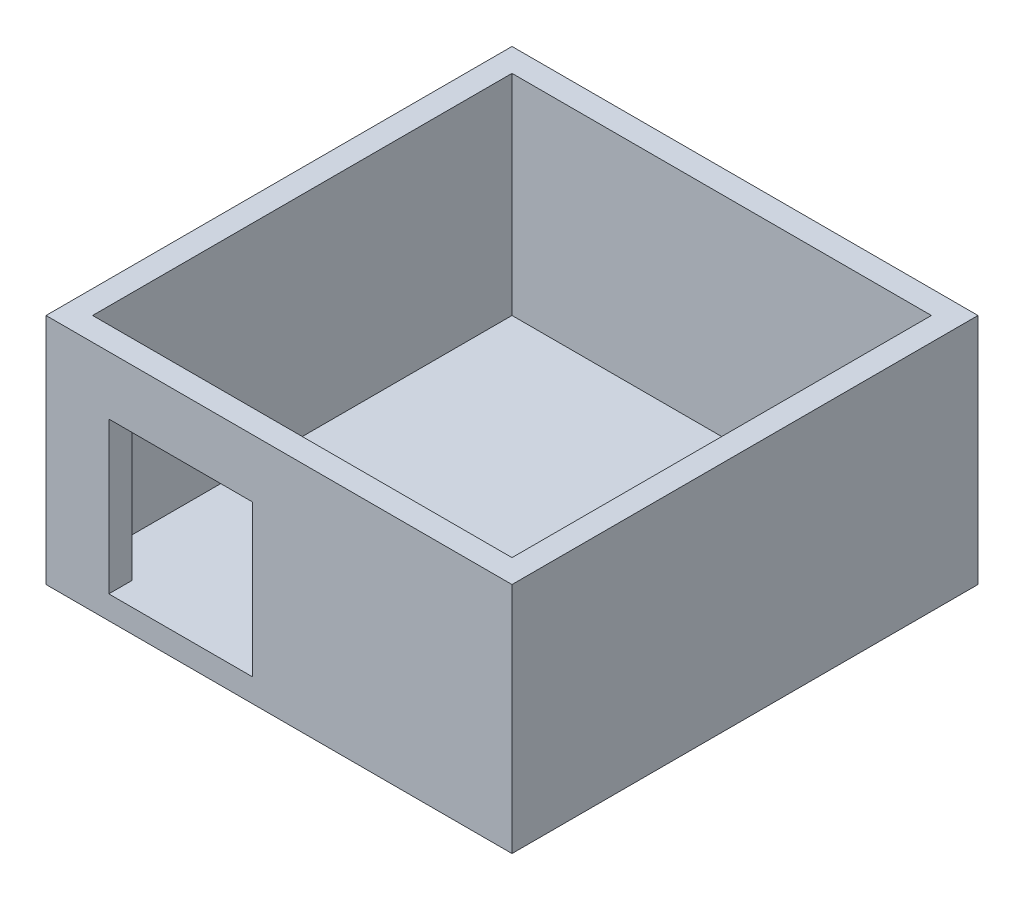
ISO-10303-21;
HEADER;
FILE_DESCRIPTION(('STEP AP214'),'2;1');
FILE_NAME('part.step','',(''),(''),'','','');
FILE_SCHEMA(('AUTOMOTIVE_DESIGN { 1 0 10303 214 1 1 1 1 }'));
ENDSEC;
DATA;
#1=APPLICATION_CONTEXT('core data for automotive mechanical design processes');
#2=APPLICATION_PROTOCOL_DEFINITION('international standard','automotive_design',2000,#1);
#3=PRODUCT_CONTEXT('',#1,'mechanical');
#4=PRODUCT('Part','Part','',(#3));
#5=PRODUCT_RELATED_PRODUCT_CATEGORY('part','',(#4));
#6=PRODUCT_DEFINITION_FORMATION('','',#4);
#7=PRODUCT_DEFINITION_CONTEXT('part definition',#1,'design');
#8=PRODUCT_DEFINITION('design','',#6,#7);
#9=PRODUCT_DEFINITION_SHAPE('','',#8);
#10=(LENGTH_UNIT() NAMED_UNIT(*) SI_UNIT(.MILLI.,.METRE.));
#11=(NAMED_UNIT(*) PLANE_ANGLE_UNIT() SI_UNIT($,.RADIAN.));
#12=(NAMED_UNIT(*) SI_UNIT($,.STERADIAN.) SOLID_ANGLE_UNIT());
#13=UNCERTAINTY_MEASURE_WITH_UNIT(LENGTH_MEASURE(1.E-05),#10,'distance_accuracy_value','');
#14=(GEOMETRIC_REPRESENTATION_CONTEXT(3) GLOBAL_UNCERTAINTY_ASSIGNED_CONTEXT((#13)) GLOBAL_UNIT_ASSIGNED_CONTEXT((#10,
#11,#12)) REPRESENTATION_CONTEXT('',''));
#15=CARTESIAN_POINT('',(0.,0.,0.));
#16=DIRECTION('',(0.,0.,1.));
#17=DIRECTION('',(1.,0.,0.));
#18=AXIS2_PLACEMENT_3D('',#15,#16,#17);
#19=CARTESIAN_POINT('',(20.,20.,-20.));
#20=DIRECTION('',(-1.,0.,0.));
#21=DIRECTION('',(0.,0.,1.));
#22=AXIS2_PLACEMENT_3D('',#19,#20,#21);
#23=PLANE('',#22);
#24=DIRECTION('',(0.,0.,-1.));
#25=VECTOR('',#24,1.);
#26=CARTESIAN_POINT('',(20.,0.,-20.));
#27=LINE('',#26,#25);
#28=CARTESIAN_POINT('',(20.,0.,20.));
#29=VERTEX_POINT('',#28);
#30=CARTESIAN_POINT('',(20.,0.,-20.));
#31=VERTEX_POINT('',#30);
#32=EDGE_CURVE('E195',#29,#31,#27,.T.);
#33=ORIENTED_EDGE('',*,*,#32,.T.);
#34=DIRECTION('',(0.,-1.,0.));
#35=VECTOR('',#34,1.);
#36=CARTESIAN_POINT('',(20.,20.,-20.));
#37=LINE('',#36,#35);
#38=CARTESIAN_POINT('',(20.,20.,-20.));
#39=VERTEX_POINT('',#38);
#40=EDGE_CURVE('E11',#39,#31,#37,.T.);
#41=ORIENTED_EDGE('',*,*,#40,.F.);
#42=DIRECTION('',(0.,0.,-1.));
#43=VECTOR('',#42,1.);
#44=CARTESIAN_POINT('',(20.,20.,-20.));
#45=LINE('',#44,#43);
#46=CARTESIAN_POINT('',(20.,20.,20.));
#47=VERTEX_POINT('',#46);
#48=EDGE_CURVE('E180',#47,#39,#45,.T.);
#49=ORIENTED_EDGE('',*,*,#48,.F.);
#50=DIRECTION('',(0.,-1.,0.));
#51=VECTOR('',#50,1.);
#52=CARTESIAN_POINT('',(20.,20.,20.));
#53=LINE('',#52,#51);
#54=EDGE_CURVE('E194',#47,#29,#53,.T.);
#55=ORIENTED_EDGE('',*,*,#54,.T.);
#56=EDGE_LOOP('',(#33,#41,#49,#55));
#57=FACE_BOUND('',#56,.T.);
#58=ADVANCED_FACE('F45',(#57),#23,.F.);
#59=CARTESIAN_POINT('',(-20.,20.,-20.));
#60=DIRECTION('',(0.,0.,1.));
#61=DIRECTION('',(1.,0.,0.));
#62=AXIS2_PLACEMENT_3D('',#59,#60,#61);
#63=PLANE('',#62);
#64=DIRECTION('',(-1.,0.,0.));
#65=VECTOR('',#64,1.);
#66=CARTESIAN_POINT('',(-20.,0.,-20.));
#67=LINE('',#66,#65);
#68=CARTESIAN_POINT('',(-20.,0.,-20.));
#69=VERTEX_POINT('',#68);
#70=EDGE_CURVE('E199',#31,#69,#67,.T.);
#71=ORIENTED_EDGE('',*,*,#70,.T.);
#72=DIRECTION('',(0.,-1.,0.));
#73=VECTOR('',#72,1.);
#74=CARTESIAN_POINT('',(-20.,20.,-20.));
#75=LINE('',#74,#73);
#76=CARTESIAN_POINT('',(-20.,20.,-20.));
#77=VERTEX_POINT('',#76);
#78=EDGE_CURVE('E53',#77,#69,#75,.T.);
#79=ORIENTED_EDGE('',*,*,#78,.F.);
#80=DIRECTION('',(-1.,0.,0.));
#81=VECTOR('',#80,1.);
#82=CARTESIAN_POINT('',(-20.,20.,-20.));
#83=LINE('',#82,#81);
#84=EDGE_CURVE('E184',#39,#77,#83,.T.);
#85=ORIENTED_EDGE('',*,*,#84,.F.);
#86=ORIENTED_EDGE('',*,*,#40,.T.);
#87=EDGE_LOOP('',(#71,#79,#85,#86));
#88=FACE_BOUND('',#87,.T.);
#89=ADVANCED_FACE('F236',(#88),#63,.F.);
#90=CARTESIAN_POINT('',(-20.,20.,-20.));
#91=DIRECTION('',(1.,0.,0.));
#92=DIRECTION('',(0.,0.,-1.));
#93=AXIS2_PLACEMENT_3D('',#90,#91,#92);
#94=PLANE('',#93);
#95=DIRECTION('',(0.,0.,1.));
#96=VECTOR('',#95,1.);
#97=CARTESIAN_POINT('',(-20.,0.,-20.));
#98=LINE('',#97,#96);
#99=CARTESIAN_POINT('',(-20.,0.,20.));
#100=VERTEX_POINT('',#99);
#101=EDGE_CURVE('E203',#69,#100,#98,.T.);
#102=ORIENTED_EDGE('',*,*,#101,.T.);
#103=DIRECTION('',(0.,-1.,0.));
#104=VECTOR('',#103,1.);
#105=CARTESIAN_POINT('',(-20.,20.,20.));
#106=LINE('',#105,#104);
#107=CARTESIAN_POINT('',(-20.,20.,20.));
#108=VERTEX_POINT('',#107);
#109=EDGE_CURVE('E211',#108,#100,#106,.T.);
#110=ORIENTED_EDGE('',*,*,#109,.F.);
#111=DIRECTION('',(0.,0.,1.));
#112=VECTOR('',#111,1.);
#113=CARTESIAN_POINT('',(-20.,20.,-20.));
#114=LINE('',#113,#112);
#115=EDGE_CURVE('E188',#77,#108,#114,.T.);
#116=ORIENTED_EDGE('',*,*,#115,.F.);
#117=ORIENTED_EDGE('',*,*,#78,.T.);
#118=EDGE_LOOP('',(#102,#110,#116,#117));
#119=FACE_BOUND('',#118,.T.);
#120=ADVANCED_FACE('F220',(#119),#94,.F.);
#121=CARTESIAN_POINT('',(-20.,20.,20.));
#122=DIRECTION('',(0.,0.,-1.));
#123=DIRECTION('',(-1.,0.,0.));
#124=AXIS2_PLACEMENT_3D('',#121,#122,#123);
#125=PLANE('',#124);
#126=DIRECTION('',(1.,0.,0.));
#127=VECTOR('',#126,1.);
#128=CARTESIAN_POINT('',(-14.6096875562385,2.,20.));
#129=LINE('',#128,#127);
#130=CARTESIAN_POINT('',(-14.6096875562385,2.,20.));
#131=VERTEX_POINT('',#130);
#132=CARTESIAN_POINT('',(-2.28968755623849,2.,20.));
#133=VERTEX_POINT('',#132);
#134=EDGE_CURVE('E287',#131,#133,#129,.T.);
#135=ORIENTED_EDGE('',*,*,#134,.F.);
#136=DIRECTION('',(0.,-1.,0.));
#137=VECTOR('',#136,1.);
#138=CARTESIAN_POINT('',(-14.6096875562385,15.,20.));
#139=LINE('',#138,#137);
#140=CARTESIAN_POINT('',(-14.6096875562385,15.,20.));
#141=VERTEX_POINT('',#140);
#142=EDGE_CURVE('E60',#141,#131,#139,.T.);
#143=ORIENTED_EDGE('',*,*,#142,.F.);
#144=DIRECTION('',(-1.,0.,0.));
#145=VECTOR('',#144,1.);
#146=CARTESIAN_POINT('',(-14.6096875562385,15.,20.));
#147=LINE('',#146,#145);
#148=CARTESIAN_POINT('',(-2.28968755623849,15.,20.));
#149=VERTEX_POINT('',#148);
#150=EDGE_CURVE('E151',#149,#141,#147,.T.);
#151=ORIENTED_EDGE('',*,*,#150,.F.);
#152=DIRECTION('',(0.,1.,0.));
#153=VECTOR('',#152,1.);
#154=CARTESIAN_POINT('',(-2.28968755623849,15.,20.));
#155=LINE('',#154,#153);
#156=EDGE_CURVE('E285',#133,#149,#155,.T.);
#157=ORIENTED_EDGE('',*,*,#156,.F.);
#158=EDGE_LOOP('',(#135,#143,#151,#157));
#159=FACE_BOUND('',#158,.T.);
#160=DIRECTION('',(1.,0.,0.));
#161=VECTOR('',#160,1.);
#162=CARTESIAN_POINT('',(-20.,0.,20.));
#163=LINE('',#162,#161);
#164=EDGE_CURVE('E185',#100,#29,#163,.T.);
#165=ORIENTED_EDGE('',*,*,#164,.T.);
#166=ORIENTED_EDGE('',*,*,#54,.F.);
#167=DIRECTION('',(1.,0.,0.));
#168=VECTOR('',#167,1.);
#169=CARTESIAN_POINT('',(-20.,20.,20.));
#170=LINE('',#169,#168);
#171=EDGE_CURVE('E191',#108,#47,#170,.T.);
#172=ORIENTED_EDGE('',*,*,#171,.F.);
#173=ORIENTED_EDGE('',*,*,#109,.T.);
#174=EDGE_LOOP('',(#165,#166,#172,#173));
#175=FACE_BOUND('',#174,.T.);
#176=ADVANCED_FACE('F229',(#159,#175),#125,.F.);
#177=CARTESIAN_POINT('',(0.,20.,0.));
#178=DIRECTION('',(0.,1.,0.));
#179=DIRECTION('',(0.,0.,1.));
#180=AXIS2_PLACEMENT_3D('',#177,#178,#179);
#181=PLANE('',#180);
#182=DIRECTION('',(0.,0.,-1.));
#183=VECTOR('',#182,1.);
#184=CARTESIAN_POINT('',(18.,20.,-20.));
#185=LINE('',#184,#183);
#186=CARTESIAN_POINT('',(18.,20.,18.));
#187=VERTEX_POINT('',#186);
#188=CARTESIAN_POINT('',(18.,20.,-18.));
#189=VERTEX_POINT('',#188);
#190=EDGE_CURVE('E159',#187,#189,#185,.T.);
#191=ORIENTED_EDGE('',*,*,#190,.F.);
#192=DIRECTION('',(1.,0.,0.));
#193=VECTOR('',#192,1.);
#194=CARTESIAN_POINT('',(-20.,20.,18.));
#195=LINE('',#194,#193);
#196=CARTESIAN_POINT('',(-18.,20.,18.));
#197=VERTEX_POINT('',#196);
#198=EDGE_CURVE('E176',#197,#187,#195,.T.);
#199=ORIENTED_EDGE('',*,*,#198,.F.);
#200=DIRECTION('',(0.,0.,1.));
#201=VECTOR('',#200,1.);
#202=CARTESIAN_POINT('',(-18.,20.,-20.));
#203=LINE('',#202,#201);
#204=CARTESIAN_POINT('',(-18.,20.,-18.));
#205=VERTEX_POINT('',#204);
#206=EDGE_CURVE('E172',#205,#197,#203,.T.);
#207=ORIENTED_EDGE('',*,*,#206,.F.);
#208=DIRECTION('',(-1.,0.,0.));
#209=VECTOR('',#208,1.);
#210=CARTESIAN_POINT('',(-20.,20.,-18.));
#211=LINE('',#210,#209);
#212=EDGE_CURVE('E164',#189,#205,#211,.T.);
#213=ORIENTED_EDGE('',*,*,#212,.F.);
#214=EDGE_LOOP('',(#191,#199,#207,#213));
#215=FACE_BOUND('',#214,.T.);
#216=ORIENTED_EDGE('',*,*,#48,.T.);
#217=ORIENTED_EDGE('',*,*,#84,.T.);
#218=ORIENTED_EDGE('',*,*,#115,.T.);
#219=ORIENTED_EDGE('',*,*,#171,.T.);
#220=EDGE_LOOP('',(#216,#217,#218,#219));
#221=FACE_BOUND('',#220,.T.);
#222=ADVANCED_FACE('F235',(#215,#221),#181,.T.);
#223=CARTESIAN_POINT('',(0.,0.,0.));
#224=DIRECTION('',(0.,1.,0.));
#225=DIRECTION('',(0.,0.,1.));
#226=AXIS2_PLACEMENT_3D('',#223,#224,#225);
#227=PLANE('',#226);
#228=ORIENTED_EDGE('',*,*,#32,.F.);
#229=ORIENTED_EDGE('',*,*,#164,.F.);
#230=ORIENTED_EDGE('',*,*,#101,.F.);
#231=ORIENTED_EDGE('',*,*,#70,.F.);
#232=EDGE_LOOP('',(#228,#229,#230,#231));
#233=FACE_BOUND('',#232,.T.);
#234=ADVANCED_FACE('F226',(#233),#227,.F.);
#235=CARTESIAN_POINT('',(18.,20.,-20.));
#236=DIRECTION('',(-1.,0.,0.));
#237=DIRECTION('',(0.,0.,1.));
#238=AXIS2_PLACEMENT_3D('',#235,#236,#237);
#239=PLANE('',#238);
#240=DIRECTION('',(0.,0.,-1.));
#241=VECTOR('',#240,1.);
#242=CARTESIAN_POINT('',(18.,2.,-20.));
#243=LINE('',#242,#241);
#244=CARTESIAN_POINT('',(18.,2.,18.));
#245=VERTEX_POINT('',#244);
#246=CARTESIAN_POINT('',(18.,2.,-18.));
#247=VERTEX_POINT('',#246);
#248=EDGE_CURVE('E299',#245,#247,#243,.T.);
#249=ORIENTED_EDGE('',*,*,#248,.F.);
#250=DIRECTION('',(0.,-1.,0.));
#251=VECTOR('',#250,1.);
#252=CARTESIAN_POINT('',(18.,20.,18.));
#253=LINE('',#252,#251);
#254=EDGE_CURVE('E179',#187,#245,#253,.T.);
#255=ORIENTED_EDGE('',*,*,#254,.F.);
#256=ORIENTED_EDGE('',*,*,#190,.T.);
#257=DIRECTION('',(0.,-1.,0.));
#258=VECTOR('',#257,1.);
#259=CARTESIAN_POINT('',(18.,20.,-18.));
#260=LINE('',#259,#258);
#261=EDGE_CURVE('E200',#189,#247,#260,.T.);
#262=ORIENTED_EDGE('',*,*,#261,.T.);
#263=EDGE_LOOP('',(#249,#255,#256,#262));
#264=FACE_BOUND('',#263,.T.);
#265=ADVANCED_FACE('F249',(#264),#239,.T.);
#266=CARTESIAN_POINT('',(-20.,20.,-18.));
#267=DIRECTION('',(0.,0.,1.));
#268=DIRECTION('',(1.,0.,0.));
#269=AXIS2_PLACEMENT_3D('',#266,#267,#268);
#270=PLANE('',#269);
#271=DIRECTION('',(-1.,0.,0.));
#272=VECTOR('',#271,1.);
#273=CARTESIAN_POINT('',(-20.,2.,-18.));
#274=LINE('',#273,#272);
#275=CARTESIAN_POINT('',(-18.,2.,-18.));
#276=VERTEX_POINT('',#275);
#277=EDGE_CURVE('E306',#247,#276,#274,.T.);
#278=ORIENTED_EDGE('',*,*,#277,.F.);
#279=ORIENTED_EDGE('',*,*,#261,.F.);
#280=ORIENTED_EDGE('',*,*,#212,.T.);
#281=DIRECTION('',(0.,-1.,0.));
#282=VECTOR('',#281,1.);
#283=CARTESIAN_POINT('',(-18.,20.,-18.));
#284=LINE('',#283,#282);
#285=EDGE_CURVE('E310',#205,#276,#284,.T.);
#286=ORIENTED_EDGE('',*,*,#285,.T.);
#287=EDGE_LOOP('',(#278,#279,#280,#286));
#288=FACE_BOUND('',#287,.T.);
#289=ADVANCED_FACE('F260',(#288),#270,.T.);
#290=CARTESIAN_POINT('',(-18.,20.,-20.));
#291=DIRECTION('',(1.,0.,0.));
#292=DIRECTION('',(0.,0.,-1.));
#293=AXIS2_PLACEMENT_3D('',#290,#291,#292);
#294=PLANE('',#293);
#295=DIRECTION('',(0.,0.,1.));
#296=VECTOR('',#295,1.);
#297=CARTESIAN_POINT('',(-18.,2.,-20.));
#298=LINE('',#297,#296);
#299=CARTESIAN_POINT('',(-18.,2.,18.));
#300=VERTEX_POINT('',#299);
#301=EDGE_CURVE('E156',#276,#300,#298,.T.);
#302=ORIENTED_EDGE('',*,*,#301,.F.);
#303=ORIENTED_EDGE('',*,*,#285,.F.);
#304=ORIENTED_EDGE('',*,*,#206,.T.);
#305=DIRECTION('',(0.,-1.,0.));
#306=VECTOR('',#305,1.);
#307=CARTESIAN_POINT('',(-18.,20.,18.));
#308=LINE('',#307,#306);
#309=EDGE_CURVE('E167',#197,#300,#308,.T.);
#310=ORIENTED_EDGE('',*,*,#309,.T.);
#311=EDGE_LOOP('',(#302,#303,#304,#310));
#312=FACE_BOUND('',#311,.T.);
#313=ADVANCED_FACE('F257',(#312),#294,.T.);
#314=CARTESIAN_POINT('',(-20.,20.,18.));
#315=DIRECTION('',(0.,0.,-1.));
#316=DIRECTION('',(-1.,0.,0.));
#317=AXIS2_PLACEMENT_3D('',#314,#315,#316);
#318=PLANE('',#317);
#319=DIRECTION('',(0.,-1.,0.));
#320=VECTOR('',#319,1.);
#321=CARTESIAN_POINT('',(-14.6096875562385,15.,18.));
#322=LINE('',#321,#320);
#323=CARTESIAN_POINT('',(-14.6096875562385,15.,18.));
#324=VERTEX_POINT('',#323);
#325=CARTESIAN_POINT('',(-14.6096875562385,2.,18.));
#326=VERTEX_POINT('',#325);
#327=EDGE_CURVE('E135',#324,#326,#322,.T.);
#328=ORIENTED_EDGE('',*,*,#327,.T.);
#329=DIRECTION('',(1.,0.,0.));
#330=VECTOR('',#329,1.);
#331=CARTESIAN_POINT('',(-20.,2.,18.));
#332=LINE('',#331,#330);
#333=EDGE_CURVE('E148',#300,#326,#332,.T.);
#334=ORIENTED_EDGE('',*,*,#333,.F.);
#335=ORIENTED_EDGE('',*,*,#309,.F.);
#336=ORIENTED_EDGE('',*,*,#198,.T.);
#337=ORIENTED_EDGE('',*,*,#254,.T.);
#338=CARTESIAN_POINT('',(-2.28968755623849,2.,18.));
#339=VERTEX_POINT('',#338);
#340=EDGE_CURVE('E160',#339,#245,#332,.T.);
#341=ORIENTED_EDGE('',*,*,#340,.F.);
#342=DIRECTION('',(0.,1.,0.));
#343=VECTOR('',#342,1.);
#344=CARTESIAN_POINT('',(-2.28968755623849,15.,18.));
#345=LINE('',#344,#343);
#346=CARTESIAN_POINT('',(-2.28968755623849,15.,18.));
#347=VERTEX_POINT('',#346);
#348=EDGE_CURVE('E68',#339,#347,#345,.T.);
#349=ORIENTED_EDGE('',*,*,#348,.T.);
#350=DIRECTION('',(-1.,0.,0.));
#351=VECTOR('',#350,1.);
#352=CARTESIAN_POINT('',(-14.6096875562385,15.,18.));
#353=LINE('',#352,#351);
#354=EDGE_CURVE('E143',#347,#324,#353,.T.);
#355=ORIENTED_EDGE('',*,*,#354,.T.);
#356=EDGE_LOOP('',(#328,#334,#335,#336,#337,#341,#349,#355));
#357=FACE_BOUND('',#356,.T.);
#358=ADVANCED_FACE('F147',(#357),#318,.T.);
#359=CARTESIAN_POINT('',(0.,2.,0.));
#360=DIRECTION('',(0.,1.,0.));
#361=DIRECTION('',(0.,0.,1.));
#362=AXIS2_PLACEMENT_3D('',#359,#360,#361);
#363=PLANE('',#362);
#364=ORIENTED_EDGE('',*,*,#248,.T.);
#365=ORIENTED_EDGE('',*,*,#277,.T.);
#366=ORIENTED_EDGE('',*,*,#301,.T.);
#367=ORIENTED_EDGE('',*,*,#333,.T.);
#368=DIRECTION('',(0.,0.,1.));
#369=VECTOR('',#368,1.);
#370=CARTESIAN_POINT('',(-14.6096875562385,2.,18.));
#371=LINE('',#370,#369);
#372=EDGE_CURVE('E132',#326,#131,#371,.T.);
#373=ORIENTED_EDGE('',*,*,#372,.T.);
#374=ORIENTED_EDGE('',*,*,#134,.T.);
#375=DIRECTION('',(0.,0.,1.));
#376=VECTOR('',#375,1.);
#377=CARTESIAN_POINT('',(-2.28968755623849,2.,18.));
#378=LINE('',#377,#376);
#379=EDGE_CURVE('E142',#339,#133,#378,.T.);
#380=ORIENTED_EDGE('',*,*,#379,.F.);
#381=ORIENTED_EDGE('',*,*,#340,.T.);
#382=EDGE_LOOP('',(#364,#365,#366,#367,#373,#374,#380,#381));
#383=FACE_BOUND('',#382,.T.);
#384=ADVANCED_FACE('F154',(#383),#363,.T.);
#385=CARTESIAN_POINT('',(-14.6096875562385,15.,18.));
#386=DIRECTION('',(-1.,0.,0.));
#387=DIRECTION('',(0.,0.,1.));
#388=AXIS2_PLACEMENT_3D('',#385,#386,#387);
#389=PLANE('',#388);
#390=ORIENTED_EDGE('',*,*,#142,.T.);
#391=ORIENTED_EDGE('',*,*,#372,.F.);
#392=ORIENTED_EDGE('',*,*,#327,.F.);
#393=DIRECTION('',(0.,0.,1.));
#394=VECTOR('',#393,1.);
#395=CARTESIAN_POINT('',(-14.6096875562385,15.,18.));
#396=LINE('',#395,#394);
#397=EDGE_CURVE('E280',#324,#141,#396,.T.);
#398=ORIENTED_EDGE('',*,*,#397,.T.);
#399=EDGE_LOOP('',(#390,#391,#392,#398));
#400=FACE_BOUND('',#399,.T.);
#401=ADVANCED_FACE('F134',(#400),#389,.F.);
#402=CARTESIAN_POINT('',(-14.6096875562385,15.,18.));
#403=DIRECTION('',(0.,1.,0.));
#404=DIRECTION('',(-1.,0.,0.));
#405=AXIS2_PLACEMENT_3D('',#402,#403,#404);
#406=PLANE('',#405);
#407=ORIENTED_EDGE('',*,*,#150,.T.);
#408=ORIENTED_EDGE('',*,*,#397,.F.);
#409=ORIENTED_EDGE('',*,*,#354,.F.);
#410=DIRECTION('',(0.,0.,1.));
#411=VECTOR('',#410,1.);
#412=CARTESIAN_POINT('',(-2.28968755623849,15.,18.));
#413=LINE('',#412,#411);
#414=EDGE_CURVE('E281',#347,#149,#413,.T.);
#415=ORIENTED_EDGE('',*,*,#414,.T.);
#416=EDGE_LOOP('',(#407,#408,#409,#415));
#417=FACE_BOUND('',#416,.T.);
#418=ADVANCED_FACE('F270',(#417),#406,.F.);
#419=CARTESIAN_POINT('',(-2.28968755623849,15.,18.));
#420=DIRECTION('',(1.,0.,0.));
#421=DIRECTION('',(0.,1.,0.));
#422=AXIS2_PLACEMENT_3D('',#419,#420,#421);
#423=PLANE('',#422);
#424=ORIENTED_EDGE('',*,*,#156,.T.);
#425=ORIENTED_EDGE('',*,*,#414,.F.);
#426=ORIENTED_EDGE('',*,*,#348,.F.);
#427=ORIENTED_EDGE('',*,*,#379,.T.);
#428=EDGE_LOOP('',(#424,#425,#426,#427));
#429=FACE_BOUND('',#428,.T.);
#430=ADVANCED_FACE('F271',(#429),#423,.F.);
#431=CLOSED_SHELL('',(#58,#89,#120,#176,#222,#234,#265,#289,#313,#358,#384,#401,#418,#430));
#432=MANIFOLD_SOLID_BREP('B2',#431);
#433=ADVANCED_BREP_SHAPE_REPRESENTATION('',(#18,#432),#14);
#434=SHAPE_DEFINITION_REPRESENTATION(#9,#433);
ENDSEC;
END-ISO-10303-21;
